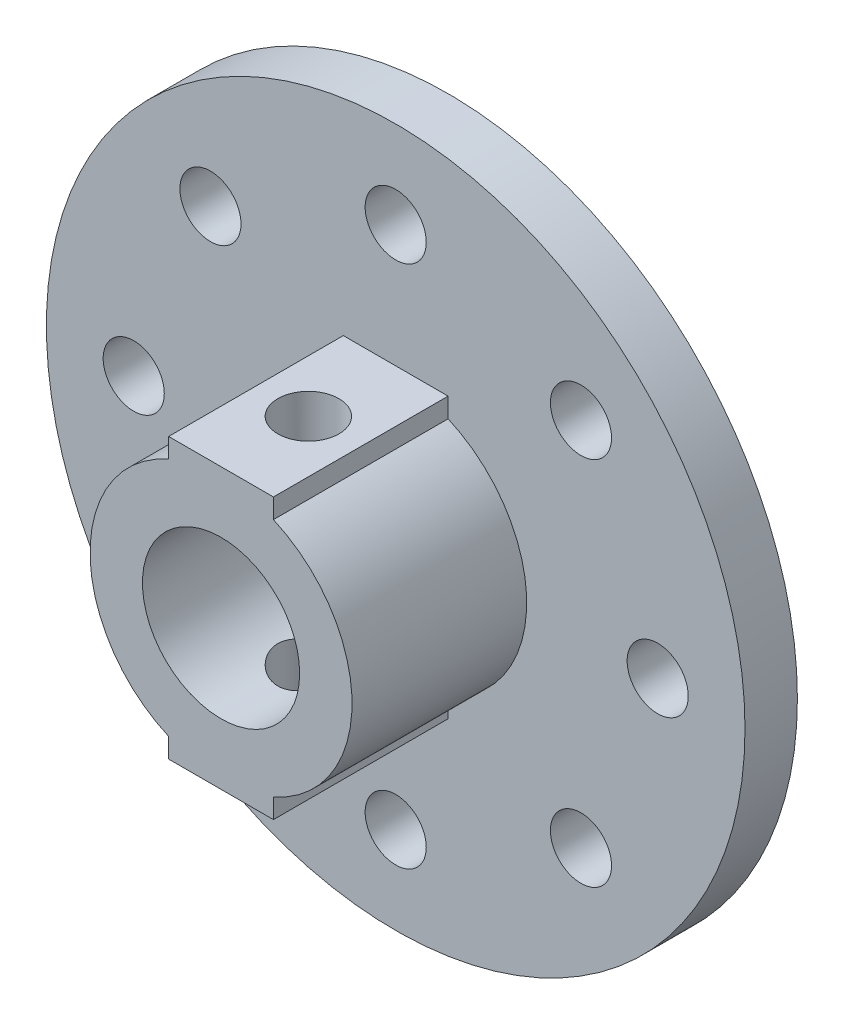
ISO-10303-21;
HEADER;
FILE_DESCRIPTION(('STEP AP214'),'2;1');
FILE_NAME('part.step','',(''),(''),'','','');
FILE_SCHEMA(('AUTOMOTIVE_DESIGN { 1 0 10303 214 1 1 1 1 }'));
ENDSEC;
DATA;
#1=APPLICATION_CONTEXT('core data for automotive mechanical design processes');
#2=APPLICATION_PROTOCOL_DEFINITION('international standard','automotive_design',2000,#1);
#3=PRODUCT_CONTEXT('',#1,'mechanical');
#4=PRODUCT('Part','Part','',(#3));
#5=PRODUCT_RELATED_PRODUCT_CATEGORY('part','',(#4));
#6=PRODUCT_DEFINITION_FORMATION('','',#4);
#7=PRODUCT_DEFINITION_CONTEXT('part definition',#1,'design');
#8=PRODUCT_DEFINITION('design','',#6,#7);
#9=PRODUCT_DEFINITION_SHAPE('','',#8);
#10=(LENGTH_UNIT() NAMED_UNIT(*) SI_UNIT(.MILLI.,.METRE.));
#11=(NAMED_UNIT(*) PLANE_ANGLE_UNIT() SI_UNIT($,.RADIAN.));
#12=(NAMED_UNIT(*) SI_UNIT($,.STERADIAN.) SOLID_ANGLE_UNIT());
#13=UNCERTAINTY_MEASURE_WITH_UNIT(LENGTH_MEASURE(1.E-05),#10,'distance_accuracy_value','');
#14=(GEOMETRIC_REPRESENTATION_CONTEXT(3) GLOBAL_UNCERTAINTY_ASSIGNED_CONTEXT((#13)) GLOBAL_UNIT_ASSIGNED_CONTEXT((#10,
#11,#12)) REPRESENTATION_CONTEXT('',''));
#15=CARTESIAN_POINT('',(0.,0.,0.));
#16=DIRECTION('',(0.,0.,1.));
#17=DIRECTION('',(1.,0.,0.));
#18=AXIS2_PLACEMENT_3D('',#15,#16,#17);
#19=CARTESIAN_POINT('',(0.,0.,3.));
#20=DIRECTION('',(0.,0.,1.));
#21=DIRECTION('',(1.,0.,0.));
#22=AXIS2_PLACEMENT_3D('',#19,#20,#21);
#23=PLANE('',#22);
#24=CARTESIAN_POINT('',(0.,15.,3.));
#25=DIRECTION('',(0.,0.,1.));
#26=DIRECTION('',(1.,0.,0.));
#27=AXIS2_PLACEMENT_3D('',#24,#25,#26);
#28=CIRCLE('',#27,1.75);
#29=CARTESIAN_POINT('',(1.75,15.,3.));
#30=VERTEX_POINT('',#29);
#31=EDGE_CURVE('E338',#30,#30,#28,.T.);
#32=ORIENTED_EDGE('',*,*,#31,.F.);
#33=EDGE_LOOP('',(#32));
#34=FACE_BOUND('',#33,.T.);
#35=CARTESIAN_POINT('',(10.6066017177986,10.6066017177991,3.));
#36=DIRECTION('',(0.,0.,1.));
#37=DIRECTION('',(1.,0.,0.));
#38=AXIS2_PLACEMENT_3D('',#35,#36,#37);
#39=CIRCLE('',#38,1.75000000000012);
#40=CARTESIAN_POINT('',(12.3566017177987,10.6066017177991,3.));
#41=VERTEX_POINT('',#40);
#42=EDGE_CURVE('E341',#41,#41,#39,.T.);
#43=ORIENTED_EDGE('',*,*,#42,.F.);
#44=EDGE_LOOP('',(#43));
#45=FACE_BOUND('',#44,.T.);
#46=CARTESIAN_POINT('',(15.0000000000013,1.2762214690701E-12,3.));
#47=DIRECTION('',(0.,0.,1.));
#48=DIRECTION('',(1.,0.,0.));
#49=AXIS2_PLACEMENT_3D('',#46,#47,#48);
#50=CIRCLE('',#49,1.7500000000009);
#51=CARTESIAN_POINT('',(16.7500000000022,1.2762214690701E-12,3.));
#52=VERTEX_POINT('',#51);
#53=EDGE_CURVE('E345',#52,#52,#50,.T.);
#54=ORIENTED_EDGE('',*,*,#53,.F.);
#55=EDGE_LOOP('',(#54));
#56=FACE_BOUND('',#55,.T.);
#57=CARTESIAN_POINT('',(10.6066017178004,-10.6066017177973,3.));
#58=DIRECTION('',(0.,0.,1.));
#59=DIRECTION('',(1.,0.,0.));
#60=AXIS2_PLACEMENT_3D('',#57,#58,#59);
#61=CIRCLE('',#60,1.75000000000189);
#62=CARTESIAN_POINT('',(12.3566017178023,-10.6066017177973,3.));
#63=VERTEX_POINT('',#62);
#64=EDGE_CURVE('E349',#63,#63,#61,.T.);
#65=ORIENTED_EDGE('',*,*,#64,.F.);
#66=EDGE_LOOP('',(#65));
#67=FACE_BOUND('',#66,.T.);
#68=CARTESIAN_POINT('',(2.5524429381402E-12,-15.,3.));
#69=DIRECTION('',(0.,0.,1.));
#70=DIRECTION('',(1.,0.,0.));
#71=AXIS2_PLACEMENT_3D('',#68,#69,#70);
#72=CIRCLE('',#71,1.75000000000254);
#73=CARTESIAN_POINT('',(1.75000000000509,-15.,3.));
#74=VERTEX_POINT('',#73);
#75=EDGE_CURVE('E353',#74,#74,#72,.T.);
#76=ORIENTED_EDGE('',*,*,#75,.F.);
#77=EDGE_LOOP('',(#76));
#78=FACE_BOUND('',#77,.T.);
#79=CARTESIAN_POINT('',(-10.606601717796,-10.6066017177991,3.));
#80=DIRECTION('',(0.,0.,1.));
#81=DIRECTION('',(1.,0.,0.));
#82=AXIS2_PLACEMENT_3D('',#79,#80,#81);
#83=CIRCLE('',#82,1.75000000000248);
#84=CARTESIAN_POINT('',(-8.85660171779356,-10.6066017177991,3.));
#85=VERTEX_POINT('',#84);
#86=EDGE_CURVE('E357',#85,#85,#83,.T.);
#87=ORIENTED_EDGE('',*,*,#86,.F.);
#88=EDGE_LOOP('',(#87));
#89=FACE_BOUND('',#88,.T.);
#90=CARTESIAN_POINT('',(-14.9999999999987,-1.27805843926882E-12,3.));
#91=DIRECTION('',(0.,0.,1.));
#92=DIRECTION('',(1.,0.,0.));
#93=AXIS2_PLACEMENT_3D('',#90,#91,#92);
#94=CIRCLE('',#93,1.75000000000175);
#95=CARTESIAN_POINT('',(-13.249999999997,-1.27805843926882E-12,3.));
#96=VERTEX_POINT('',#95);
#97=EDGE_CURVE('E361',#96,#96,#94,.T.);
#98=ORIENTED_EDGE('',*,*,#97,.F.);
#99=EDGE_LOOP('',(#98));
#100=FACE_BOUND('',#99,.T.);
#101=CARTESIAN_POINT('',(-10.6066017177978,10.6066017177973,3.));
#102=DIRECTION('',(0.,0.,1.));
#103=DIRECTION('',(1.,0.,0.));
#104=AXIS2_PLACEMENT_3D('',#101,#102,#103);
#105=CIRCLE('',#104,1.7500000000008);
#106=CARTESIAN_POINT('',(-8.85660171779704,10.6066017177973,3.));
#107=VERTEX_POINT('',#106);
#108=EDGE_CURVE('E333',#107,#107,#105,.T.);
#109=ORIENTED_EDGE('',*,*,#108,.F.);
#110=EDGE_LOOP('',(#109));
#111=FACE_BOUND('',#110,.T.);
#112=CARTESIAN_POINT('',(0.,0.,3.));
#113=DIRECTION('',(0.,0.,1.));
#114=DIRECTION('',(1.,0.,0.));
#115=AXIS2_PLACEMENT_3D('',#112,#113,#114);
#116=CIRCLE('',#115,20.);
#117=CARTESIAN_POINT('',(20.,0.,3.));
#118=VERTEX_POINT('',#117);
#119=EDGE_CURVE('E147',#118,#118,#116,.T.);
#120=ORIENTED_EDGE('',*,*,#119,.T.);
#121=EDGE_LOOP('',(#120));
#122=FACE_BOUND('',#121,.T.);
#123=DIRECTION('',(-1.,0.,0.));
#124=VECTOR('',#123,1.);
#125=CARTESIAN_POINT('',(-3.,8.,3.));
#126=LINE('',#125,#124);
#127=CARTESIAN_POINT('',(3.,8.,3.));
#128=VERTEX_POINT('',#127);
#129=CARTESIAN_POINT('',(-3.,8.,3.));
#130=VERTEX_POINT('',#129);
#131=EDGE_CURVE('E278',#128,#130,#126,.T.);
#132=ORIENTED_EDGE('',*,*,#131,.F.);
#133=DIRECTION('',(0.,1.,0.));
#134=VECTOR('',#133,1.);
#135=CARTESIAN_POINT('',(3.,8.,3.));
#136=LINE('',#135,#134);
#137=CARTESIAN_POINT('',(3.,6.87386354243376,3.));
#138=VERTEX_POINT('',#137);
#139=EDGE_CURVE('E130',#138,#128,#136,.T.);
#140=ORIENTED_EDGE('',*,*,#139,.F.);
#141=CARTESIAN_POINT('',(0.,0.,3.));
#142=DIRECTION('',(0.,0.,1.));
#143=DIRECTION('',(1.,0.,0.));
#144=AXIS2_PLACEMENT_3D('',#141,#142,#143);
#145=CIRCLE('',#144,7.5);
#146=CARTESIAN_POINT('',(3.,-6.87386354243376,3.));
#147=VERTEX_POINT('',#146);
#148=EDGE_CURVE('E51',#147,#138,#145,.T.);
#149=ORIENTED_EDGE('',*,*,#148,.F.);
#150=CARTESIAN_POINT('',(3.,-8.,3.));
#151=VERTEX_POINT('',#150);
#152=EDGE_CURVE('E267',#151,#147,#136,.T.);
#153=ORIENTED_EDGE('',*,*,#152,.F.);
#154=DIRECTION('',(1.,0.,0.));
#155=VECTOR('',#154,1.);
#156=CARTESIAN_POINT('',(-3.,-8.,3.));
#157=LINE('',#156,#155);
#158=CARTESIAN_POINT('',(-3.,-8.,3.));
#159=VERTEX_POINT('',#158);
#160=EDGE_CURVE('E117',#159,#151,#157,.T.);
#161=ORIENTED_EDGE('',*,*,#160,.F.);
#162=DIRECTION('',(0.,-1.,0.));
#163=VECTOR('',#162,1.);
#164=CARTESIAN_POINT('',(-3.,8.,3.));
#165=LINE('',#164,#163);
#166=CARTESIAN_POINT('',(-3.,-6.87386354243376,3.));
#167=VERTEX_POINT('',#166);
#168=EDGE_CURVE('E280',#167,#159,#165,.T.);
#169=ORIENTED_EDGE('',*,*,#168,.F.);
#170=CARTESIAN_POINT('',(-3.,6.87386354243376,3.));
#171=VERTEX_POINT('',#170);
#172=EDGE_CURVE('E11',#171,#167,#145,.T.);
#173=ORIENTED_EDGE('',*,*,#172,.F.);
#174=EDGE_CURVE('E281',#130,#171,#165,.T.);
#175=ORIENTED_EDGE('',*,*,#174,.F.);
#176=EDGE_LOOP('',(#132,#140,#149,#153,#161,#169,#173,#175));
#177=FACE_BOUND('',#176,.T.);
#178=ADVANCED_FACE('F37',(#34,#45,#56,#67,#78,#89,#100,#111,#122,#177),#23,.T.);
#179=CARTESIAN_POINT('',(0.,0.,13.));
#180=DIRECTION('',(0.,0.,-1.));
#181=DIRECTION('',(-1.,0.,0.));
#182=AXIS2_PLACEMENT_3D('',#179,#180,#181);
#183=CYLINDRICAL_SURFACE('',#182,7.5);
#184=DIRECTION('',(0.,0.,-1.));
#185=VECTOR('',#184,1.);
#186=CARTESIAN_POINT('',(3.,6.87386354243376,13.));
#187=LINE('',#186,#185);
#188=CARTESIAN_POINT('',(3.,6.87386354243376,13.));
#189=VERTEX_POINT('',#188);
#190=EDGE_CURVE('E142',#189,#138,#187,.T.);
#191=ORIENTED_EDGE('',*,*,#190,.F.);
#192=CARTESIAN_POINT('',(0.,0.,13.));
#193=DIRECTION('',(0.,0.,1.));
#194=DIRECTION('',(1.,0.,0.));
#195=AXIS2_PLACEMENT_3D('',#192,#193,#194);
#196=CIRCLE('',#195,7.5);
#197=CARTESIAN_POINT('',(3.,-6.87386354243376,13.));
#198=VERTEX_POINT('',#197);
#199=EDGE_CURVE('E113',#198,#189,#196,.T.);
#200=ORIENTED_EDGE('',*,*,#199,.F.);
#201=DIRECTION('',(0.,0.,-1.));
#202=VECTOR('',#201,1.);
#203=CARTESIAN_POINT('',(3.,-6.87386354243376,13.));
#204=LINE('',#203,#202);
#205=EDGE_CURVE('E140',#147,#198,#204,.F.);
#206=ORIENTED_EDGE('',*,*,#205,.F.);
#207=ORIENTED_EDGE('',*,*,#148,.T.);
#208=EDGE_LOOP('',(#191,#200,#206,#207));
#209=FACE_BOUND('',#208,.T.);
#210=ADVANCED_FACE('F205',(#209),#183,.T.);
#211=DIRECTION('',(0.,0.,-1.));
#212=VECTOR('',#211,1.);
#213=CARTESIAN_POINT('',(-3.,-6.87386354243376,13.));
#214=LINE('',#213,#212);
#215=CARTESIAN_POINT('',(-3.,-6.87386354243376,13.));
#216=VERTEX_POINT('',#215);
#217=EDGE_CURVE('E133',#216,#167,#214,.T.);
#218=ORIENTED_EDGE('',*,*,#217,.F.);
#219=CARTESIAN_POINT('',(-3.,6.87386354243376,13.));
#220=VERTEX_POINT('',#219);
#221=EDGE_CURVE('E144',#220,#216,#196,.T.);
#222=ORIENTED_EDGE('',*,*,#221,.F.);
#223=DIRECTION('',(0.,0.,-1.));
#224=VECTOR('',#223,1.);
#225=CARTESIAN_POINT('',(-3.,6.87386354243376,13.));
#226=LINE('',#225,#224);
#227=EDGE_CURVE('E131',#171,#220,#226,.F.);
#228=ORIENTED_EDGE('',*,*,#227,.F.);
#229=ORIENTED_EDGE('',*,*,#172,.T.);
#230=EDGE_LOOP('',(#218,#222,#228,#229));
#231=FACE_BOUND('',#230,.T.);
#232=ADVANCED_FACE('F211',(#231),#183,.T.);
#233=CARTESIAN_POINT('',(0.,0.,3.));
#234=DIRECTION('',(0.,0.,-1.));
#235=DIRECTION('',(-1.,0.,0.));
#236=AXIS2_PLACEMENT_3D('',#233,#234,#235);
#237=CYLINDRICAL_SURFACE('',#236,20.);
#238=ORIENTED_EDGE('',*,*,#119,.F.);
#239=EDGE_LOOP('',(#238));
#240=FACE_BOUND('',#239,.T.);
#241=CARTESIAN_POINT('',(0.,0.,0.));
#242=DIRECTION('',(0.,0.,1.));
#243=DIRECTION('',(1.,0.,0.));
#244=AXIS2_PLACEMENT_3D('',#241,#242,#243);
#245=CIRCLE('',#244,20.);
#246=CARTESIAN_POINT('',(20.,0.,0.));
#247=VERTEX_POINT('',#246);
#248=EDGE_CURVE('E150',#247,#247,#245,.T.);
#249=ORIENTED_EDGE('',*,*,#248,.T.);
#250=EDGE_LOOP('',(#249));
#251=FACE_BOUND('',#250,.T.);
#252=ADVANCED_FACE('F39',(#240,#251),#237,.T.);
#253=CARTESIAN_POINT('',(0.,0.,0.));
#254=DIRECTION('',(0.,0.,1.));
#255=DIRECTION('',(1.,0.,0.));
#256=AXIS2_PLACEMENT_3D('',#253,#254,#255);
#257=PLANE('',#256);
#258=CARTESIAN_POINT('',(0.,15.,0.));
#259=DIRECTION('',(0.,0.,1.));
#260=DIRECTION('',(1.,0.,0.));
#261=AXIS2_PLACEMENT_3D('',#258,#259,#260);
#262=CIRCLE('',#261,1.75);
#263=CARTESIAN_POINT('',(1.75,15.,0.));
#264=VERTEX_POINT('',#263);
#265=EDGE_CURVE('E230',#264,#264,#262,.T.);
#266=ORIENTED_EDGE('',*,*,#265,.T.);
#267=EDGE_LOOP('',(#266));
#268=FACE_BOUND('',#267,.T.);
#269=CARTESIAN_POINT('',(10.6066017177986,10.6066017177991,0.));
#270=DIRECTION('',(0.,0.,1.));
#271=DIRECTION('',(1.,0.,0.));
#272=AXIS2_PLACEMENT_3D('',#269,#270,#271);
#273=CIRCLE('',#272,1.75000000000012);
#274=CARTESIAN_POINT('',(12.3566017177987,10.6066017177991,0.));
#275=VERTEX_POINT('',#274);
#276=EDGE_CURVE('E234',#275,#275,#273,.T.);
#277=ORIENTED_EDGE('',*,*,#276,.T.);
#278=EDGE_LOOP('',(#277));
#279=FACE_BOUND('',#278,.T.);
#280=CARTESIAN_POINT('',(15.0000000000013,1.2762214690701E-12,0.));
#281=DIRECTION('',(0.,0.,1.));
#282=DIRECTION('',(1.,0.,0.));
#283=AXIS2_PLACEMENT_3D('',#280,#281,#282);
#284=CIRCLE('',#283,1.7500000000009);
#285=CARTESIAN_POINT('',(16.7500000000022,1.2762214690701E-12,0.));
#286=VERTEX_POINT('',#285);
#287=EDGE_CURVE('E238',#286,#286,#284,.T.);
#288=ORIENTED_EDGE('',*,*,#287,.T.);
#289=EDGE_LOOP('',(#288));
#290=FACE_BOUND('',#289,.T.);
#291=CARTESIAN_POINT('',(10.6066017178004,-10.6066017177973,0.));
#292=DIRECTION('',(0.,0.,1.));
#293=DIRECTION('',(1.,0.,0.));
#294=AXIS2_PLACEMENT_3D('',#291,#292,#293);
#295=CIRCLE('',#294,1.75000000000189);
#296=CARTESIAN_POINT('',(12.3566017178023,-10.6066017177973,0.));
#297=VERTEX_POINT('',#296);
#298=EDGE_CURVE('E242',#297,#297,#295,.T.);
#299=ORIENTED_EDGE('',*,*,#298,.T.);
#300=EDGE_LOOP('',(#299));
#301=FACE_BOUND('',#300,.T.);
#302=CARTESIAN_POINT('',(2.5524429381402E-12,-15.,0.));
#303=DIRECTION('',(0.,0.,1.));
#304=DIRECTION('',(1.,0.,0.));
#305=AXIS2_PLACEMENT_3D('',#302,#303,#304);
#306=CIRCLE('',#305,1.75000000000254);
#307=CARTESIAN_POINT('',(1.75000000000509,-15.,0.));
#308=VERTEX_POINT('',#307);
#309=EDGE_CURVE('E246',#308,#308,#306,.T.);
#310=ORIENTED_EDGE('',*,*,#309,.T.);
#311=EDGE_LOOP('',(#310));
#312=FACE_BOUND('',#311,.T.);
#313=CARTESIAN_POINT('',(-10.606601717796,-10.6066017177991,0.));
#314=DIRECTION('',(0.,0.,1.));
#315=DIRECTION('',(1.,0.,0.));
#316=AXIS2_PLACEMENT_3D('',#313,#314,#315);
#317=CIRCLE('',#316,1.75000000000248);
#318=CARTESIAN_POINT('',(-8.85660171779356,-10.6066017177991,0.));
#319=VERTEX_POINT('',#318);
#320=EDGE_CURVE('E250',#319,#319,#317,.T.);
#321=ORIENTED_EDGE('',*,*,#320,.T.);
#322=EDGE_LOOP('',(#321));
#323=FACE_BOUND('',#322,.T.);
#324=CARTESIAN_POINT('',(-14.9999999999987,-1.27805843926882E-12,0.));
#325=DIRECTION('',(0.,0.,1.));
#326=DIRECTION('',(1.,0.,0.));
#327=AXIS2_PLACEMENT_3D('',#324,#325,#326);
#328=CIRCLE('',#327,1.75000000000175);
#329=CARTESIAN_POINT('',(-13.249999999997,-1.27805843926882E-12,0.));
#330=VERTEX_POINT('',#329);
#331=EDGE_CURVE('E254',#330,#330,#328,.T.);
#332=ORIENTED_EDGE('',*,*,#331,.T.);
#333=EDGE_LOOP('',(#332));
#334=FACE_BOUND('',#333,.T.);
#335=CARTESIAN_POINT('',(-10.6066017177978,10.6066017177973,0.));
#336=DIRECTION('',(0.,0.,1.));
#337=DIRECTION('',(1.,0.,0.));
#338=AXIS2_PLACEMENT_3D('',#335,#336,#337);
#339=CIRCLE('',#338,1.7500000000008);
#340=CARTESIAN_POINT('',(-8.85660171779704,10.6066017177973,0.));
#341=VERTEX_POINT('',#340);
#342=EDGE_CURVE('E257',#341,#341,#339,.T.);
#343=ORIENTED_EDGE('',*,*,#342,.T.);
#344=EDGE_LOOP('',(#343));
#345=FACE_BOUND('',#344,.T.);
#346=CARTESIAN_POINT('',(0.,0.,0.));
#347=DIRECTION('',(0.,0.,1.));
#348=DIRECTION('',(1.,0.,0.));
#349=AXIS2_PLACEMENT_3D('',#346,#347,#348);
#350=CIRCLE('',#349,4.5);
#351=CARTESIAN_POINT('',(4.5,0.,0.));
#352=VERTEX_POINT('',#351);
#353=EDGE_CURVE('E261',#352,#352,#350,.T.);
#354=ORIENTED_EDGE('',*,*,#353,.T.);
#355=EDGE_LOOP('',(#354));
#356=FACE_BOUND('',#355,.T.);
#357=ORIENTED_EDGE('',*,*,#248,.F.);
#358=EDGE_LOOP('',(#357));
#359=FACE_BOUND('',#358,.T.);
#360=ADVANCED_FACE('F217',(#268,#279,#290,#301,#312,#323,#334,#345,#356,#359),#257,.F.);
#361=CARTESIAN_POINT('',(0.,0.,13.));
#362=DIRECTION('',(0.,0.,1.));
#363=DIRECTION('',(1.,0.,0.));
#364=AXIS2_PLACEMENT_3D('',#361,#362,#363);
#365=PLANE('',#364);
#366=CARTESIAN_POINT('',(0.,0.,13.));
#367=DIRECTION('',(0.,0.,1.));
#368=DIRECTION('',(1.,0.,0.));
#369=AXIS2_PLACEMENT_3D('',#366,#367,#368);
#370=CIRCLE('',#369,4.5);
#371=CARTESIAN_POINT('',(4.5,0.,13.));
#372=VERTEX_POINT('',#371);
#373=EDGE_CURVE('E265',#372,#372,#370,.T.);
#374=ORIENTED_EDGE('',*,*,#373,.F.);
#375=EDGE_LOOP('',(#374));
#376=FACE_BOUND('',#375,.T.);
#377=ORIENTED_EDGE('',*,*,#221,.T.);
#378=DIRECTION('',(0.,-1.,0.));
#379=VECTOR('',#378,1.);
#380=CARTESIAN_POINT('',(-3.,8.,13.));
#381=LINE('',#380,#379);
#382=CARTESIAN_POINT('',(-3.,-8.,13.));
#383=VERTEX_POINT('',#382);
#384=EDGE_CURVE('E126',#216,#383,#381,.T.);
#385=ORIENTED_EDGE('',*,*,#384,.T.);
#386=DIRECTION('',(1.,0.,0.));
#387=VECTOR('',#386,1.);
#388=CARTESIAN_POINT('',(-3.,-8.,13.));
#389=LINE('',#388,#387);
#390=CARTESIAN_POINT('',(3.,-8.,13.));
#391=VERTEX_POINT('',#390);
#392=EDGE_CURVE('E275',#383,#391,#389,.T.);
#393=ORIENTED_EDGE('',*,*,#392,.T.);
#394=DIRECTION('',(0.,1.,0.));
#395=VECTOR('',#394,1.);
#396=CARTESIAN_POINT('',(3.,8.,13.));
#397=LINE('',#396,#395);
#398=EDGE_CURVE('E59',#391,#198,#397,.T.);
#399=ORIENTED_EDGE('',*,*,#398,.T.);
#400=ORIENTED_EDGE('',*,*,#199,.T.);
#401=CARTESIAN_POINT('',(3.,8.,13.));
#402=VERTEX_POINT('',#401);
#403=EDGE_CURVE('E107',#189,#402,#397,.T.);
#404=ORIENTED_EDGE('',*,*,#403,.T.);
#405=DIRECTION('',(-1.,0.,0.));
#406=VECTOR('',#405,1.);
#407=CARTESIAN_POINT('',(-3.,8.,13.));
#408=LINE('',#407,#406);
#409=CARTESIAN_POINT('',(-3.,8.,13.));
#410=VERTEX_POINT('',#409);
#411=EDGE_CURVE('E110',#402,#410,#408,.T.);
#412=ORIENTED_EDGE('',*,*,#411,.T.);
#413=EDGE_CURVE('E66',#410,#220,#381,.T.);
#414=ORIENTED_EDGE('',*,*,#413,.T.);
#415=EDGE_LOOP('',(#377,#385,#393,#399,#400,#404,#412,#414));
#416=FACE_BOUND('',#415,.T.);
#417=ADVANCED_FACE('F109',(#376,#416),#365,.T.);
#418=CARTESIAN_POINT('',(-3.,8.,13.));
#419=DIRECTION('',(1.,0.,0.));
#420=DIRECTION('',(0.,1.,0.));
#421=AXIS2_PLACEMENT_3D('',#418,#419,#420);
#422=PLANE('',#421);
#423=ORIENTED_EDGE('',*,*,#384,.F.);
#424=ORIENTED_EDGE('',*,*,#217,.T.);
#425=ORIENTED_EDGE('',*,*,#168,.T.);
#426=DIRECTION('',(0.,0.,-1.));
#427=VECTOR('',#426,1.);
#428=CARTESIAN_POINT('',(-3.,-8.,13.));
#429=LINE('',#428,#427);
#430=EDGE_CURVE('E135',#383,#159,#429,.T.);
#431=ORIENTED_EDGE('',*,*,#430,.F.);
#432=EDGE_LOOP('',(#423,#424,#425,#431));
#433=FACE_BOUND('',#432,.T.);
#434=ADVANCED_FACE('F224',(#433),#422,.F.);
#435=CARTESIAN_POINT('',(3.,8.,13.));
#436=DIRECTION('',(-1.,0.,0.));
#437=DIRECTION('',(0.,-1.,0.));
#438=AXIS2_PLACEMENT_3D('',#435,#436,#437);
#439=PLANE('',#438);
#440=ORIENTED_EDGE('',*,*,#152,.T.);
#441=ORIENTED_EDGE('',*,*,#205,.T.);
#442=ORIENTED_EDGE('',*,*,#398,.F.);
#443=DIRECTION('',(0.,0.,-1.));
#444=VECTOR('',#443,1.);
#445=CARTESIAN_POINT('',(3.,-8.,13.));
#446=LINE('',#445,#444);
#447=EDGE_CURVE('E276',#391,#151,#446,.T.);
#448=ORIENTED_EDGE('',*,*,#447,.T.);
#449=EDGE_LOOP('',(#440,#441,#442,#448));
#450=FACE_BOUND('',#449,.T.);
#451=ADVANCED_FACE('F300',(#450),#439,.F.);
#452=CARTESIAN_POINT('',(-3.,-8.,13.));
#453=DIRECTION('',(0.,1.,0.));
#454=DIRECTION('',(0.,0.,1.));
#455=AXIS2_PLACEMENT_3D('',#452,#453,#454);
#456=PLANE('',#455);
#457=CARTESIAN_POINT('',(0.,-8.,8.));
#458=DIRECTION('',(0.,1.,0.));
#459=DIRECTION('',(0.,0.,1.));
#460=AXIS2_PLACEMENT_3D('',#457,#458,#459);
#461=CIRCLE('',#460,1.75);
#462=CARTESIAN_POINT('',(0.,-8.,9.75));
#463=VERTEX_POINT('',#462);
#464=EDGE_CURVE('E329',#463,#463,#461,.T.);
#465=ORIENTED_EDGE('',*,*,#464,.T.);
#466=EDGE_LOOP('',(#465));
#467=FACE_BOUND('',#466,.T.);
#468=ORIENTED_EDGE('',*,*,#160,.T.);
#469=ORIENTED_EDGE('',*,*,#447,.F.);
#470=ORIENTED_EDGE('',*,*,#392,.F.);
#471=ORIENTED_EDGE('',*,*,#430,.T.);
#472=EDGE_LOOP('',(#468,#469,#470,#471));
#473=FACE_BOUND('',#472,.T.);
#474=ADVANCED_FACE('F290',(#467,#473),#456,.F.);
#475=ORIENTED_EDGE('',*,*,#403,.F.);
#476=ORIENTED_EDGE('',*,*,#190,.T.);
#477=ORIENTED_EDGE('',*,*,#139,.T.);
#478=DIRECTION('',(0.,0.,-1.));
#479=VECTOR('',#478,1.);
#480=CARTESIAN_POINT('',(3.,8.,13.));
#481=LINE('',#480,#479);
#482=EDGE_CURVE('E122',#402,#128,#481,.T.);
#483=ORIENTED_EDGE('',*,*,#482,.F.);
#484=EDGE_LOOP('',(#475,#476,#477,#483));
#485=FACE_BOUND('',#484,.T.);
#486=ADVANCED_FACE('F128',(#485),#439,.F.);
#487=ORIENTED_EDGE('',*,*,#174,.T.);
#488=ORIENTED_EDGE('',*,*,#227,.T.);
#489=ORIENTED_EDGE('',*,*,#413,.F.);
#490=DIRECTION('',(0.,0.,-1.));
#491=VECTOR('',#490,1.);
#492=CARTESIAN_POINT('',(-3.,8.,13.));
#493=LINE('',#492,#491);
#494=EDGE_CURVE('E125',#410,#130,#493,.T.);
#495=ORIENTED_EDGE('',*,*,#494,.T.);
#496=EDGE_LOOP('',(#487,#488,#489,#495));
#497=FACE_BOUND('',#496,.T.);
#498=ADVANCED_FACE('F303',(#497),#422,.F.);
#499=CARTESIAN_POINT('',(-3.,8.,13.));
#500=DIRECTION('',(0.,-1.,0.));
#501=DIRECTION('',(0.,0.,-1.));
#502=AXIS2_PLACEMENT_3D('',#499,#500,#501);
#503=PLANE('',#502);
#504=CARTESIAN_POINT('',(0.,8.,8.));
#505=DIRECTION('',(0.,-1.,0.));
#506=DIRECTION('',(0.,0.,-1.));
#507=AXIS2_PLACEMENT_3D('',#504,#505,#506);
#508=CIRCLE('',#507,1.75);
#509=CARTESIAN_POINT('',(0.,8.,6.25));
#510=VERTEX_POINT('',#509);
#511=EDGE_CURVE('E331',#510,#510,#508,.T.);
#512=ORIENTED_EDGE('',*,*,#511,.T.);
#513=EDGE_LOOP('',(#512));
#514=FACE_BOUND('',#513,.T.);
#515=ORIENTED_EDGE('',*,*,#131,.T.);
#516=ORIENTED_EDGE('',*,*,#494,.F.);
#517=ORIENTED_EDGE('',*,*,#411,.F.);
#518=ORIENTED_EDGE('',*,*,#482,.T.);
#519=EDGE_LOOP('',(#515,#516,#517,#518));
#520=FACE_BOUND('',#519,.T.);
#521=ADVANCED_FACE('F121',(#514,#520),#503,.F.);
#522=CARTESIAN_POINT('',(0.,0.,0.));
#523=DIRECTION('',(0.,0.,1.));
#524=DIRECTION('',(1.,0.,0.));
#525=AXIS2_PLACEMENT_3D('',#522,#523,#524);
#526=CYLINDRICAL_SURFACE('',#525,4.5);
#527=CARTESIAN_POINT('',(0.,-4.5,9.75));
#528=CARTESIAN_POINT('',(-0.0945216116231133,-4.50000357890976,9.75000466114727));
#529=CARTESIAN_POINT('',(-0.189012588974276,-4.49699657235603,9.74231850581659));
#530=CARTESIAN_POINT('',(-0.375157095621194,-4.48530338756881,9.71191260533744));
#531=CARTESIAN_POINT('',(-0.466811257942965,-4.47661848604882,9.68919623982065));
#532=CARTESIAN_POINT('',(-0.644569415695737,-4.45449751263017,9.62966395724063));
#533=CARTESIAN_POINT('',(-0.730684201241587,-4.44107102989426,9.59287648457201));
#534=CARTESIAN_POINT('',(-0.895509610305324,-4.41079282434057,9.5063966061002));
#535=CARTESIAN_POINT('',(-0.974218091743785,-4.39394011500362,9.4567004823406));
#536=CARTESIAN_POINT('',(-1.12555176600737,-4.35768696402247,9.34347465600633));
#537=CARTESIAN_POINT('',(-1.19779891271444,-4.33821073882029,9.27946418799051));
#538=CARTESIAN_POINT('',(-1.33084266886211,-4.29926410972336,9.14044732998162));
#539=CARTESIAN_POINT('',(-1.39163537873751,-4.27979371005603,9.06543721065024));
#540=CARTESIAN_POINT('',(-1.5025400591669,-4.24216350922566,8.90275084845642));
#541=CARTESIAN_POINT('',(-1.55210248066998,-4.22409192828477,8.81467749421714));
#542=CARTESIAN_POINT('',(-1.63554172723799,-4.19249433932349,8.63063368794473));
#543=CARTESIAN_POINT('',(-1.66942535668049,-4.1789663601433,8.53466668298325));
#544=CARTESIAN_POINT('',(-1.71902708764805,-4.15880257084895,8.34192316205962));
#545=CARTESIAN_POINT('',(-1.73547043602239,-4.15189286416949,8.24536294980962));
#546=CARTESIAN_POINT('',(-1.75199151472946,-4.14495045931833,8.05062548023642));
#547=CARTESIAN_POINT('',(-1.75207667610848,-4.14491463854117,7.95244897741773));
#548=CARTESIAN_POINT('',(-1.73643069370047,-4.15148930319338,7.7640804405754));
#549=CARTESIAN_POINT('',(-1.72172945761324,-4.15766700235832,7.67378488117678));
#550=CARTESIAN_POINT('',(-1.67863865338662,-4.17524945770577,7.49706090472742));
#551=CARTESIAN_POINT('',(-1.65024686146124,-4.18665506305328,7.4106331184205));
#552=CARTESIAN_POINT('',(-1.58005179443056,-4.21365271626082,7.2420829709595));
#553=CARTESIAN_POINT('',(-1.53799445721784,-4.22932307646113,7.1600795174722));
#554=CARTESIAN_POINT('',(-1.44183987128371,-4.26306100406182,7.00400453147573));
#555=CARTESIAN_POINT('',(-1.38773825329531,-4.28112944044196,6.92993589193474));
#556=CARTESIAN_POINT('',(-1.26440337893233,-4.31922892923802,6.78616644668129));
#557=CARTESIAN_POINT('',(-1.19435591484143,-4.33930715956176,6.71717482415479));
#558=CARTESIAN_POINT('',(-1.04346328587167,-4.37804136065515,6.5916980466897));
#559=CARTESIAN_POINT('',(-0.962616205925915,-4.39669707825065,6.53521511461599));
#560=CARTESIAN_POINT('',(-0.790499551019091,-4.43090662383363,6.4354965215154));
#561=CARTESIAN_POINT('',(-0.699070445395465,-4.44639951393914,6.39251380178542));
#562=CARTESIAN_POINT('',(-0.509524956315279,-4.47208114014078,6.322779641107));
#563=CARTESIAN_POINT('',(-0.41141180164557,-4.48227241696576,6.29602042423777));
#564=CARTESIAN_POINT('',(-0.217238781026653,-4.49574685184384,6.26089504531826));
#565=CARTESIAN_POINT('',(-0.12137618519869,-4.49938783597809,6.25157496302051));
#566=CARTESIAN_POINT('',(0.0706022558697154,-4.50046894131888,6.24879334054757));
#567=CARTESIAN_POINT('',(0.166718034214656,-4.49791056281854,6.25532796341309));
#568=CARTESIAN_POINT('',(0.352242008871035,-4.48711560256918,6.28335782810439));
#569=CARTESIAN_POINT('',(0.441762429458578,-4.47912178447378,6.30421381234065));
#570=CARTESIAN_POINT('',(0.615959651152374,-4.45850787906716,6.35943728486949));
#571=CARTESIAN_POINT('',(0.700635823764004,-4.44588719303079,6.39380652184337));
#572=CARTESIAN_POINT('',(0.86560523436115,-4.41678144851864,6.47619402651537));
#573=CARTESIAN_POINT('',(0.945689638098328,-4.40019144454658,6.52459222374632));
#574=CARTESIAN_POINT('',(1.09687647672475,-4.3649625001582,6.63323894385632));
#575=CARTESIAN_POINT('',(1.16797541280994,-4.34632276685946,6.69349205965342));
#576=CARTESIAN_POINT('',(1.30382380300944,-4.30759122109571,6.82855677458888));
#577=CARTESIAN_POINT('',(1.36789970134046,-4.28748140660688,6.90404244574617));
#578=CARTESIAN_POINT('',(1.48262564949143,-4.24917515368351,7.06506976211291));
#579=CARTESIAN_POINT('',(1.53327397046123,-4.23097896181675,7.15061270018789));
#580=CARTESIAN_POINT('',(1.61989819212987,-4.19858244892527,7.33033966524272));
#581=CARTESIAN_POINT('',(1.65576827914435,-4.18441116332615,7.42458029050008));
#582=CARTESIAN_POINT('',(1.71087089906812,-4.16218937940006,7.61847631294353));
#583=CARTESIAN_POINT('',(1.73011480230191,-4.15413469850287,7.7181279599887));
#584=CARTESIAN_POINT('',(1.75036340880477,-4.14564074731701,7.91265807533371));
#585=CARTESIAN_POINT('',(1.75252783727916,-4.14471735003347,8.00739555313281));
#586=CARTESIAN_POINT('',(1.74156812524648,-4.14933433805869,8.19581223529425));
#587=CARTESIAN_POINT('',(1.72844567598556,-4.1548740083335,8.28949155556698));
#588=CARTESIAN_POINT('',(1.68821256290742,-4.1713765270337,8.46975605429394));
#589=CARTESIAN_POINT('',(1.66161232658634,-4.18214092060007,8.55647493245168));
#590=CARTESIAN_POINT('',(1.59564352261878,-4.20775087444452,8.72426092460094));
#591=CARTESIAN_POINT('',(1.55627161906199,-4.22259750083155,8.80532655525735));
#592=CARTESIAN_POINT('',(1.46336245966471,-4.25571696636597,8.96437243844227));
#593=CARTESIAN_POINT('',(1.40916363976662,-4.27413362217158,9.04193585259473));
#594=CARTESIAN_POINT('',(1.28913141336766,-4.31185518542399,9.1872352512418));
#595=CARTESIAN_POINT('',(1.22329417160083,-4.33116038412078,9.25496798274355));
#596=CARTESIAN_POINT('',(1.07714479787778,-4.36987394857856,9.38283635129427));
#597=CARTESIAN_POINT('',(0.996201578925434,-4.38921913759408,9.44227326247125));
#598=CARTESIAN_POINT('',(0.82479104218433,-4.42463279405307,9.54670413361426));
#599=CARTESIAN_POINT('',(0.73432173285254,-4.44070057424458,9.59169506548287));
#600=CARTESIAN_POINT('',(0.539177942484049,-4.46874642995128,9.66840530862738));
#601=CARTESIAN_POINT('',(0.433946807083796,-4.480325733796,9.69887105382039));
#602=CARTESIAN_POINT('',(0.219128275784336,-4.49594815787146,9.73965958541112));
#603=CARTESIAN_POINT('',(0.109543565297217,-4.49999585230798,9.74999459807465));
#604=CARTESIAN_POINT('',(0.,-4.5,9.75));
#605=B_SPLINE_CURVE_WITH_KNOTS('',3,(#527,#528,#529,#530,#531,#532,#533,#534,#535,#536,#537,
#538,#539,#540,#541,#542,#543,#544,#545,#546,#547,#548,#549,#550,#551,#552,#553,#554,#555,#556,
#557,#558,#559,#560,#561,#562,#563,#564,#565,#566,#567,#568,#569,#570,#571,#572,#573,#574,#575,
#576,#577,#578,#579,#580,#581,#582,#583,#584,#585,#586,#587,#588,#589,#590,#591,#592,#593,#594,
#595,#596,#597,#598,#599,#600,#601,#602,#603,#604),.UNSPECIFIED.,.T.,.F.,(4,2,2,2,2,2,2,2,2,2,2,
2,2,2,2,2,2,2,2,2,2,2,2,2,2,2,2,2,2,2,2,2,2,2,2,2,2,2,4),(0.,0.283160503864036,
0.566257359041776,0.84878493978484,1.13139398467333,1.4255069476259,1.71971985862072,
2.0261724914916,2.33249200315932,2.62550346855176,2.91838182708358,3.19218218311021,
3.46602702809766,3.74528609985654,4.02464664313578,4.32431978760003,4.62404614301729,
4.92909277058723,5.23399307356052,5.52166383595859,5.80926498678779,6.08479830266445,
6.36036728564718,6.64423643005733,6.92821577043193,7.2299248580641,7.53167277301018,
7.83554518221999,8.13920961411627,8.42206063024588,8.70488035644985,8.97771101372533,
9.25061299077639,9.53856816273042,9.82661840345187,10.1319344787653,10.4373145112639,
10.7656761078696,11.0938382139952),.UNSPECIFIED.);
#606=CARTESIAN_POINT('',(0.,-4.5,9.75));
#607=VERTEX_POINT('',#606);
#608=EDGE_CURVE('E41',#607,#607,#605,.T.);
#609=ORIENTED_EDGE('',*,*,#608,.T.);
#610=EDGE_LOOP('',(#609));
#611=FACE_BOUND('',#610,.T.);
#612=CARTESIAN_POINT('',(0.,4.5,9.75));
#613=CARTESIAN_POINT('',(0.0945216116231107,4.50000357890976,9.75000466114727));
#614=CARTESIAN_POINT('',(0.189012588974274,4.49699657235603,9.74231850581659));
#615=CARTESIAN_POINT('',(0.375157095621191,4.48530338756881,9.71191260533744));
#616=CARTESIAN_POINT('',(0.466811257942963,4.47661848604882,9.68919623982065));
#617=CARTESIAN_POINT('',(0.644569415695734,4.45449751263017,9.62966395724064));
#618=CARTESIAN_POINT('',(0.730684201241585,4.44107102989426,9.59287648457201));
#619=CARTESIAN_POINT('',(0.895509610305321,4.41079282434057,9.5063966061002));
#620=CARTESIAN_POINT('',(0.974218091743782,4.39394011500363,9.4567004823406));
#621=CARTESIAN_POINT('',(1.12555176600736,4.35768696402247,9.34347465600633));
#622=CARTESIAN_POINT('',(1.19779891271444,4.33821073882029,9.27946418799051));
#623=CARTESIAN_POINT('',(1.33084266886211,4.29926410972336,9.14044732998162));
#624=CARTESIAN_POINT('',(1.39163537873751,4.27979371005603,9.06543721065024));
#625=CARTESIAN_POINT('',(1.5025400591669,4.24216350922566,8.90275084845642));
#626=CARTESIAN_POINT('',(1.55210248066998,4.22409192828478,8.81467749421714));
#627=CARTESIAN_POINT('',(1.63554172723799,4.19249433932349,8.63063368794473));
#628=CARTESIAN_POINT('',(1.66942535668049,4.1789663601433,8.53466668298325));
#629=CARTESIAN_POINT('',(1.71902708764804,4.15880257084895,8.34192316205962));
#630=CARTESIAN_POINT('',(1.73547043602239,4.15189286416949,8.24536294980961));
#631=CARTESIAN_POINT('',(1.75199151472946,4.14495045931833,8.05062548023641));
#632=CARTESIAN_POINT('',(1.75207667610848,4.14491463854117,7.95244897741773));
#633=CARTESIAN_POINT('',(1.73643069370047,4.15148930319339,7.7640804405754));
#634=CARTESIAN_POINT('',(1.72172945761324,4.15766700235832,7.67378488117678));
#635=CARTESIAN_POINT('',(1.67863865338661,4.17524945770577,7.49706090472742));
#636=CARTESIAN_POINT('',(1.65024686146124,4.18665506305328,7.4106331184205));
#637=CARTESIAN_POINT('',(1.58005179443056,4.21365271626082,7.2420829709595));
#638=CARTESIAN_POINT('',(1.53799445721784,4.22932307646113,7.1600795174722));
#639=CARTESIAN_POINT('',(1.44183987128371,4.26306100406182,7.00400453147573));
#640=CARTESIAN_POINT('',(1.38773825329531,4.28112944044196,6.92993589193474));
#641=CARTESIAN_POINT('',(1.26440337893232,4.31922892923802,6.78616644668129));
#642=CARTESIAN_POINT('',(1.19435591484142,4.33930715956176,6.71717482415479));
#643=CARTESIAN_POINT('',(1.04346328587167,4.37804136065515,6.5916980466897));
#644=CARTESIAN_POINT('',(0.962616205925912,4.39669707825065,6.53521511461599));
#645=CARTESIAN_POINT('',(0.790499551019089,4.43090662383363,6.4354965215154));
#646=CARTESIAN_POINT('',(0.699070445395462,4.44639951393914,6.39251380178542));
#647=CARTESIAN_POINT('',(0.509524956315276,4.47208114014078,6.322779641107));
#648=CARTESIAN_POINT('',(0.411411801645567,4.48227241696576,6.29602042423777));
#649=CARTESIAN_POINT('',(0.217238781026651,4.49574685184384,6.26089504531826));
#650=CARTESIAN_POINT('',(0.121376185198687,4.49938783597809,6.25157496302051));
#651=CARTESIAN_POINT('',(-0.070602255869718,4.50046894131888,6.24879334054757));
#652=CARTESIAN_POINT('',(-0.166718034214659,4.49791056281854,6.2553279634131));
#653=CARTESIAN_POINT('',(-0.352242008871038,4.48711560256918,6.28335782810439));
#654=CARTESIAN_POINT('',(-0.441762429458581,4.47912178447378,6.30421381234065));
#655=CARTESIAN_POINT('',(-0.615959651152376,4.45850787906716,6.35943728486949));
#656=CARTESIAN_POINT('',(-0.700635823764006,4.44588719303079,6.39380652184337));
#657=CARTESIAN_POINT('',(-0.865605234361153,4.41678144851864,6.47619402651537));
#658=CARTESIAN_POINT('',(-0.945689638098331,4.40019144454658,6.52459222374632));
#659=CARTESIAN_POINT('',(-1.09687647672475,4.3649625001582,6.63323894385632));
#660=CARTESIAN_POINT('',(-1.16797541280995,4.34632276685946,6.69349205965342));
#661=CARTESIAN_POINT('',(-1.30382380300944,4.30759122109571,6.82855677458888));
#662=CARTESIAN_POINT('',(-1.36789970134046,4.28748140660688,6.90404244574617));
#663=CARTESIAN_POINT('',(-1.48262564949143,4.24917515368351,7.06506976211291));
#664=CARTESIAN_POINT('',(-1.53327397046123,4.23097896181675,7.15061270018789));
#665=CARTESIAN_POINT('',(-1.61989819212987,4.19858244892526,7.33033966524272));
#666=CARTESIAN_POINT('',(-1.65576827914435,4.18441116332615,7.42458029050008));
#667=CARTESIAN_POINT('',(-1.71087089906812,4.16218937940006,7.61847631294353));
#668=CARTESIAN_POINT('',(-1.73011480230191,4.15413469850287,7.7181279599887));
#669=CARTESIAN_POINT('',(-1.75036340880477,4.14564074731701,7.91265807533371));
#670=CARTESIAN_POINT('',(-1.75252783727917,4.14471735003347,8.00739555313281));
#671=CARTESIAN_POINT('',(-1.74156812524648,4.14933433805869,8.19581223529425));
#672=CARTESIAN_POINT('',(-1.72844567598556,4.1548740083335,8.28949155556698));
#673=CARTESIAN_POINT('',(-1.68821256290743,4.1713765270337,8.46975605429394));
#674=CARTESIAN_POINT('',(-1.66161232658634,4.18214092060007,8.55647493245168));
#675=CARTESIAN_POINT('',(-1.59564352261878,4.20775087444452,8.72426092460094));
#676=CARTESIAN_POINT('',(-1.55627161906199,4.22259750083155,8.80532655525735));
#677=CARTESIAN_POINT('',(-1.46336245966471,4.25571696636597,8.96437243844227));
#678=CARTESIAN_POINT('',(-1.40916363976662,4.27413362217158,9.04193585259473));
#679=CARTESIAN_POINT('',(-1.28913141336766,4.31185518542399,9.1872352512418));
#680=CARTESIAN_POINT('',(-1.22329417160084,4.33116038412078,9.25496798274355));
#681=CARTESIAN_POINT('',(-1.07714479787779,4.36987394857856,9.38283635129427));
#682=CARTESIAN_POINT('',(-0.996201578925437,4.38921913759408,9.44227326247125));
#683=CARTESIAN_POINT('',(-0.824791042184333,4.42463279405307,9.54670413361426));
#684=CARTESIAN_POINT('',(-0.734321732852543,4.44070057424457,9.59169506548287));
#685=CARTESIAN_POINT('',(-0.539177942484052,4.46874642995128,9.66840530862738));
#686=CARTESIAN_POINT('',(-0.433946807083798,4.480325733796,9.69887105382039));
#687=CARTESIAN_POINT('',(-0.219128275784339,4.49594815787146,9.73965958541112));
#688=CARTESIAN_POINT('',(-0.10954356529722,4.49999585230798,9.74999459807465));
#689=CARTESIAN_POINT('',(0.,4.5,9.75));
#690=B_SPLINE_CURVE_WITH_KNOTS('',3,(#612,#613,#614,#615,#616,#617,#618,#619,#620,#621,#622,
#623,#624,#625,#626,#627,#628,#629,#630,#631,#632,#633,#634,#635,#636,#637,#638,#639,#640,#641,
#642,#643,#644,#645,#646,#647,#648,#649,#650,#651,#652,#653,#654,#655,#656,#657,#658,#659,#660,
#661,#662,#663,#664,#665,#666,#667,#668,#669,#670,#671,#672,#673,#674,#675,#676,#677,#678,#679,
#680,#681,#682,#683,#684,#685,#686,#687,#688,#689),.UNSPECIFIED.,.T.,.F.,(4,2,2,2,2,2,2,2,2,2,2,
2,2,2,2,2,2,2,2,2,2,2,2,2,2,2,2,2,2,2,2,2,2,2,2,2,2,2,4),(0.,0.283160503864036,
0.566257359041775,0.84878493978484,1.13139398467333,1.4255069476259,1.71971985862072,
2.02617249149161,2.33249200315932,2.62550346855176,2.91838182708358,3.19218218311021,
3.46602702809766,3.74528609985654,4.02464664313578,4.32431978760003,4.62404614301729,
4.92909277058723,5.23399307356052,5.52166383595859,5.80926498678779,6.08479830266445,
6.36036728564718,6.64423643005733,6.92821577043193,7.2299248580641,7.53167277301018,
7.83554518221999,8.13920961411627,8.42206063024588,8.70488035644985,8.97771101372533,
9.25061299077639,9.53856816273042,9.82661840345187,10.1319344787653,10.4373145112639,
10.7656761078696,11.0938382139952),.UNSPECIFIED.);
#691=CARTESIAN_POINT('',(0.,4.5,9.75));
#692=VERTEX_POINT('',#691);
#693=EDGE_CURVE('E152',#692,#692,#690,.T.);
#694=ORIENTED_EDGE('',*,*,#693,.T.);
#695=EDGE_LOOP('',(#694));
#696=FACE_BOUND('',#695,.T.);
#697=ORIENTED_EDGE('',*,*,#353,.F.);
#698=EDGE_LOOP('',(#697));
#699=FACE_BOUND('',#698,.T.);
#700=ORIENTED_EDGE('',*,*,#373,.T.);
#701=EDGE_LOOP('',(#700));
#702=FACE_BOUND('',#701,.T.);
#703=ADVANCED_FACE('F157',(#611,#696,#699,#702),#526,.F.);
#704=CARTESIAN_POINT('',(-10.6066017177978,10.6066017177973,0.));
#705=DIRECTION('',(0.,0.,1.));
#706=DIRECTION('',(1.,0.,0.));
#707=AXIS2_PLACEMENT_3D('',#704,#705,#706);
#708=CYLINDRICAL_SURFACE('',#707,1.7500000000008);
#709=ORIENTED_EDGE('',*,*,#342,.F.);
#710=EDGE_LOOP('',(#709));
#711=FACE_BOUND('',#710,.T.);
#712=ORIENTED_EDGE('',*,*,#108,.T.);
#713=EDGE_LOOP('',(#712));
#714=FACE_BOUND('',#713,.T.);
#715=ADVANCED_FACE('F194',(#711,#714),#708,.F.);
#716=CARTESIAN_POINT('',(-14.9999999999987,-1.27805843926882E-12,0.));
#717=DIRECTION('',(0.,0.,1.));
#718=DIRECTION('',(1.,0.,0.));
#719=AXIS2_PLACEMENT_3D('',#716,#717,#718);
#720=CYLINDRICAL_SURFACE('',#719,1.75000000000175);
#721=ORIENTED_EDGE('',*,*,#331,.F.);
#722=EDGE_LOOP('',(#721));
#723=FACE_BOUND('',#722,.T.);
#724=ORIENTED_EDGE('',*,*,#97,.T.);
#725=EDGE_LOOP('',(#724));
#726=FACE_BOUND('',#725,.T.);
#727=ADVANCED_FACE('F191',(#723,#726),#720,.F.);
#728=CARTESIAN_POINT('',(-10.606601717796,-10.6066017177991,0.));
#729=DIRECTION('',(0.,0.,1.));
#730=DIRECTION('',(1.,0.,0.));
#731=AXIS2_PLACEMENT_3D('',#728,#729,#730);
#732=CYLINDRICAL_SURFACE('',#731,1.75000000000248);
#733=ORIENTED_EDGE('',*,*,#320,.F.);
#734=EDGE_LOOP('',(#733));
#735=FACE_BOUND('',#734,.T.);
#736=ORIENTED_EDGE('',*,*,#86,.T.);
#737=EDGE_LOOP('',(#736));
#738=FACE_BOUND('',#737,.T.);
#739=ADVANCED_FACE('F187',(#735,#738),#732,.F.);
#740=CARTESIAN_POINT('',(2.5524429381402E-12,-15.,0.));
#741=DIRECTION('',(0.,0.,1.));
#742=DIRECTION('',(1.,0.,0.));
#743=AXIS2_PLACEMENT_3D('',#740,#741,#742);
#744=CYLINDRICAL_SURFACE('',#743,1.75000000000254);
#745=ORIENTED_EDGE('',*,*,#309,.F.);
#746=EDGE_LOOP('',(#745));
#747=FACE_BOUND('',#746,.T.);
#748=ORIENTED_EDGE('',*,*,#75,.T.);
#749=EDGE_LOOP('',(#748));
#750=FACE_BOUND('',#749,.T.);
#751=ADVANCED_FACE('F183',(#747,#750),#744,.F.);
#752=CARTESIAN_POINT('',(10.6066017178004,-10.6066017177973,0.));
#753=DIRECTION('',(0.,0.,1.));
#754=DIRECTION('',(1.,0.,0.));
#755=AXIS2_PLACEMENT_3D('',#752,#753,#754);
#756=CYLINDRICAL_SURFACE('',#755,1.75000000000189);
#757=ORIENTED_EDGE('',*,*,#298,.F.);
#758=EDGE_LOOP('',(#757));
#759=FACE_BOUND('',#758,.T.);
#760=ORIENTED_EDGE('',*,*,#64,.T.);
#761=EDGE_LOOP('',(#760));
#762=FACE_BOUND('',#761,.T.);
#763=ADVANCED_FACE('F179',(#759,#762),#756,.F.);
#764=CARTESIAN_POINT('',(15.0000000000013,1.2762214690701E-12,0.));
#765=DIRECTION('',(0.,0.,1.));
#766=DIRECTION('',(1.,0.,0.));
#767=AXIS2_PLACEMENT_3D('',#764,#765,#766);
#768=CYLINDRICAL_SURFACE('',#767,1.7500000000009);
#769=ORIENTED_EDGE('',*,*,#287,.F.);
#770=EDGE_LOOP('',(#769));
#771=FACE_BOUND('',#770,.T.);
#772=ORIENTED_EDGE('',*,*,#53,.T.);
#773=EDGE_LOOP('',(#772));
#774=FACE_BOUND('',#773,.T.);
#775=ADVANCED_FACE('F175',(#771,#774),#768,.F.);
#776=CARTESIAN_POINT('',(10.6066017177986,10.6066017177991,0.));
#777=DIRECTION('',(0.,0.,1.));
#778=DIRECTION('',(1.,0.,0.));
#779=AXIS2_PLACEMENT_3D('',#776,#777,#778);
#780=CYLINDRICAL_SURFACE('',#779,1.75000000000012);
#781=ORIENTED_EDGE('',*,*,#276,.F.);
#782=EDGE_LOOP('',(#781));
#783=FACE_BOUND('',#782,.T.);
#784=ORIENTED_EDGE('',*,*,#42,.T.);
#785=EDGE_LOOP('',(#784));
#786=FACE_BOUND('',#785,.T.);
#787=ADVANCED_FACE('F171',(#783,#786),#780,.F.);
#788=CARTESIAN_POINT('',(0.,15.,0.));
#789=DIRECTION('',(0.,0.,1.));
#790=DIRECTION('',(1.,0.,0.));
#791=AXIS2_PLACEMENT_3D('',#788,#789,#790);
#792=CYLINDRICAL_SURFACE('',#791,1.75);
#793=ORIENTED_EDGE('',*,*,#265,.F.);
#794=EDGE_LOOP('',(#793));
#795=FACE_BOUND('',#794,.T.);
#796=ORIENTED_EDGE('',*,*,#31,.T.);
#797=EDGE_LOOP('',(#796));
#798=FACE_BOUND('',#797,.T.);
#799=ADVANCED_FACE('F167',(#795,#798),#792,.F.);
#800=CARTESIAN_POINT('',(0.,-20.,8.));
#801=DIRECTION('',(0.,1.,0.));
#802=DIRECTION('',(0.,0.,1.));
#803=AXIS2_PLACEMENT_3D('',#800,#801,#802);
#804=CYLINDRICAL_SURFACE('',#803,1.75);
#805=ORIENTED_EDGE('',*,*,#693,.F.);
#806=EDGE_LOOP('',(#805));
#807=FACE_BOUND('',#806,.T.);
#808=ORIENTED_EDGE('',*,*,#511,.F.);
#809=EDGE_LOOP('',(#808));
#810=FACE_BOUND('',#809,.T.);
#811=ADVANCED_FACE('F165',(#807,#810),#804,.F.);
#812=ORIENTED_EDGE('',*,*,#608,.F.);
#813=EDGE_LOOP('',(#812));
#814=FACE_BOUND('',#813,.T.);
#815=ORIENTED_EDGE('',*,*,#464,.F.);
#816=EDGE_LOOP('',(#815));
#817=FACE_BOUND('',#816,.T.);
#818=ADVANCED_FACE('F161',(#814,#817),#804,.F.);
#819=CLOSED_SHELL('',(#178,#210,#232,#252,#360,#417,#434,#451,#474,#486,#498,#521,#703,#715,
#727,#739,#751,#763,#775,#787,#799,#811,#818));
#820=MANIFOLD_SOLID_BREP('B2',#819);
#821=ADVANCED_BREP_SHAPE_REPRESENTATION('',(#18,#820),#14);
#822=SHAPE_DEFINITION_REPRESENTATION(#9,#821);
ENDSEC;
END-ISO-10303-21;
